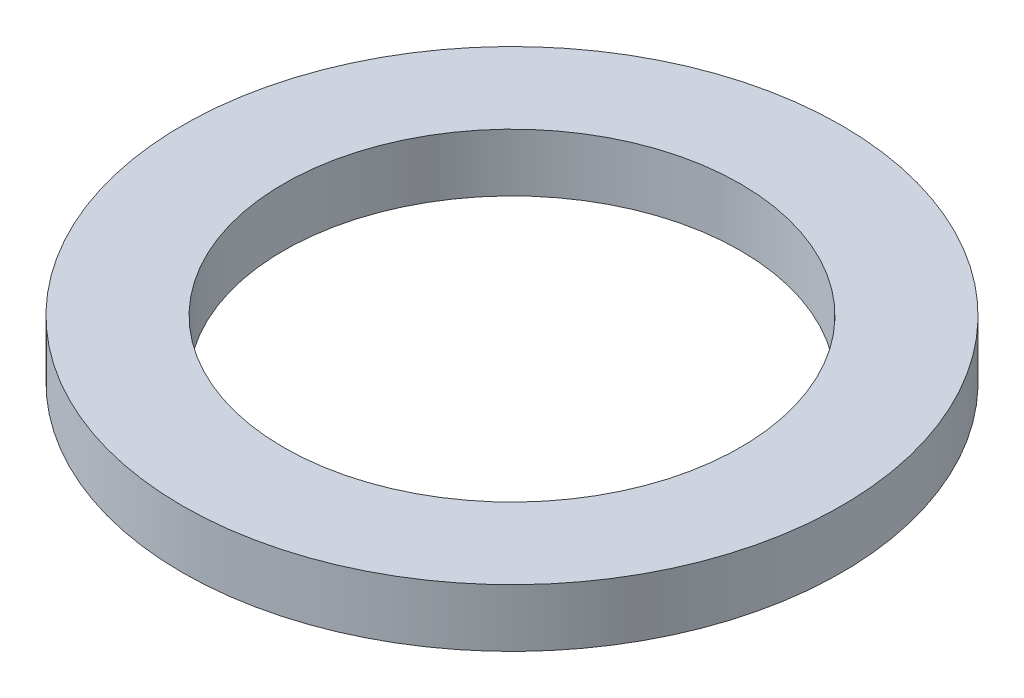
ISO-10303-21;
HEADER;
FILE_DESCRIPTION(('STEP AP214'),'2;1');
FILE_NAME('part.step','',(''),(''),'','','');
FILE_SCHEMA(('AUTOMOTIVE_DESIGN { 1 0 10303 214 1 1 1 1 }'));
ENDSEC;
DATA;
#1=APPLICATION_CONTEXT('core data for automotive mechanical design processes');
#2=APPLICATION_PROTOCOL_DEFINITION('international standard','automotive_design',2000,#1);
#3=PRODUCT_CONTEXT('',#1,'mechanical');
#4=PRODUCT('Part','Part','',(#3));
#5=PRODUCT_RELATED_PRODUCT_CATEGORY('part','',(#4));
#6=PRODUCT_DEFINITION_FORMATION('','',#4);
#7=PRODUCT_DEFINITION_CONTEXT('part definition',#1,'design');
#8=PRODUCT_DEFINITION('design','',#6,#7);
#9=PRODUCT_DEFINITION_SHAPE('','',#8);
#10=(LENGTH_UNIT() NAMED_UNIT(*) SI_UNIT(.MILLI.,.METRE.));
#11=(NAMED_UNIT(*) PLANE_ANGLE_UNIT() SI_UNIT($,.RADIAN.));
#12=(NAMED_UNIT(*) SI_UNIT($,.STERADIAN.) SOLID_ANGLE_UNIT());
#13=UNCERTAINTY_MEASURE_WITH_UNIT(LENGTH_MEASURE(1.E-05),#10,'distance_accuracy_value','');
#14=(GEOMETRIC_REPRESENTATION_CONTEXT(3) GLOBAL_UNCERTAINTY_ASSIGNED_CONTEXT((#13)) GLOBAL_UNIT_ASSIGNED_CONTEXT((#10,
#11,#12)) REPRESENTATION_CONTEXT('',''));
#15=CARTESIAN_POINT('',(0.,0.,0.));
#16=DIRECTION('',(0.,0.,1.));
#17=DIRECTION('',(1.,0.,0.));
#18=AXIS2_PLACEMENT_3D('',#15,#16,#17);
#19=CARTESIAN_POINT('',(0.,2.,0.));
#20=DIRECTION('',(0.,1.,0.));
#21=DIRECTION('',(0.,0.,1.));
#22=AXIS2_PLACEMENT_3D('',#19,#20,#21);
#23=PLANE('',#22);
#24=CARTESIAN_POINT('',(0.,2.,0.));
#25=DIRECTION('',(0.,1.,0.));
#26=DIRECTION('',(0.,0.,1.));
#27=AXIS2_PLACEMENT_3D('',#24,#25,#26);
#28=CIRCLE('',#27,11.4);
#29=CARTESIAN_POINT('',(0.,2.,11.4));
#30=VERTEX_POINT('',#29);
#31=EDGE_CURVE('E10',#30,#30,#28,.T.);
#32=ORIENTED_EDGE('',*,*,#31,.T.);
#33=EDGE_LOOP('',(#32));
#34=FACE_BOUND('',#33,.T.);
#35=CARTESIAN_POINT('',(0.,2.,0.));
#36=DIRECTION('',(0.,1.,0.));
#37=DIRECTION('',(0.,0.,1.));
#38=AXIS2_PLACEMENT_3D('',#35,#36,#37);
#39=CIRCLE('',#38,7.9);
#40=CARTESIAN_POINT('',(0.,2.,7.9));
#41=VERTEX_POINT('',#40);
#42=EDGE_CURVE('E54',#41,#41,#39,.T.);
#43=ORIENTED_EDGE('',*,*,#42,.F.);
#44=EDGE_LOOP('',(#43));
#45=FACE_BOUND('',#44,.T.);
#46=ADVANCED_FACE('F41',(#34,#45),#23,.T.);
#47=CARTESIAN_POINT('',(0.,0.,0.));
#48=DIRECTION('',(0.,1.,0.));
#49=DIRECTION('',(0.,0.,1.));
#50=AXIS2_PLACEMENT_3D('',#47,#48,#49);
#51=PLANE('',#50);
#52=CARTESIAN_POINT('',(0.,0.,0.));
#53=DIRECTION('',(0.,1.,0.));
#54=DIRECTION('',(0.,0.,1.));
#55=AXIS2_PLACEMENT_3D('',#52,#53,#54);
#56=CIRCLE('',#55,11.4);
#57=CARTESIAN_POINT('',(0.,0.,11.4));
#58=VERTEX_POINT('',#57);
#59=EDGE_CURVE('E45',#58,#58,#56,.T.);
#60=ORIENTED_EDGE('',*,*,#59,.F.);
#61=EDGE_LOOP('',(#60));
#62=FACE_BOUND('',#61,.T.);
#63=CARTESIAN_POINT('',(0.,0.,0.));
#64=DIRECTION('',(0.,1.,0.));
#65=DIRECTION('',(0.,0.,1.));
#66=AXIS2_PLACEMENT_3D('',#63,#64,#65);
#67=CIRCLE('',#66,7.9);
#68=CARTESIAN_POINT('',(0.,0.,7.9));
#69=VERTEX_POINT('',#68);
#70=EDGE_CURVE('E56',#69,#69,#67,.T.);
#71=ORIENTED_EDGE('',*,*,#70,.T.);
#72=EDGE_LOOP('',(#71));
#73=FACE_BOUND('',#72,.T.);
#74=ADVANCED_FACE('F68',(#62,#73),#51,.F.);
#75=CARTESIAN_POINT('',(0.,2.,0.));
#76=DIRECTION('',(0.,-1.,0.));
#77=DIRECTION('',(0.,0.,-1.));
#78=AXIS2_PLACEMENT_3D('',#75,#76,#77);
#79=CYLINDRICAL_SURFACE('',#78,11.4);
#80=ORIENTED_EDGE('',*,*,#31,.F.);
#81=EDGE_LOOP('',(#80));
#82=FACE_BOUND('',#81,.T.);
#83=ORIENTED_EDGE('',*,*,#59,.T.);
#84=EDGE_LOOP('',(#83));
#85=FACE_BOUND('',#84,.T.);
#86=ADVANCED_FACE('F43',(#82,#85),#79,.T.);
#87=CARTESIAN_POINT('',(0.,2.,0.));
#88=DIRECTION('',(0.,-1.,0.));
#89=DIRECTION('',(0.,0.,-1.));
#90=AXIS2_PLACEMENT_3D('',#87,#88,#89);
#91=CYLINDRICAL_SURFACE('',#90,7.9);
#92=ORIENTED_EDGE('',*,*,#42,.T.);
#93=EDGE_LOOP('',(#92));
#94=FACE_BOUND('',#93,.T.);
#95=ORIENTED_EDGE('',*,*,#70,.F.);
#96=EDGE_LOOP('',(#95));
#97=FACE_BOUND('',#96,.T.);
#98=ADVANCED_FACE('F64',(#94,#97),#91,.F.);
#99=CLOSED_SHELL('',(#46,#74,#86,#98));
#100=MANIFOLD_SOLID_BREP('B2',#99);
#101=ADVANCED_BREP_SHAPE_REPRESENTATION('',(#18,#100),#14);
#102=SHAPE_DEFINITION_REPRESENTATION(#9,#101);
ENDSEC;
END-ISO-10303-21;
